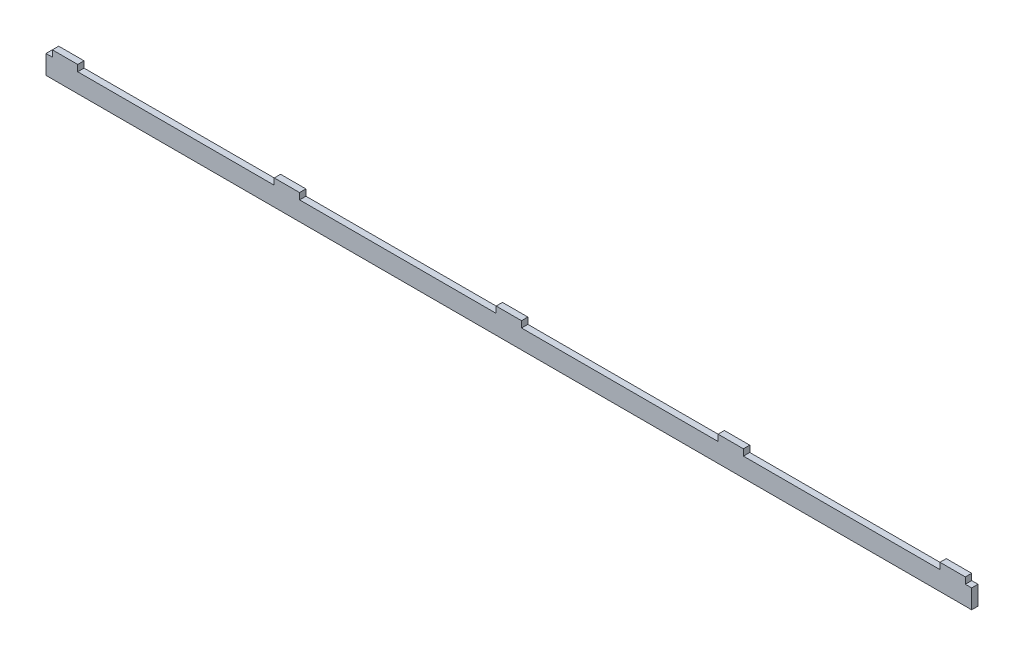
ISO-10303-21;
HEADER;
FILE_DESCRIPTION(('STEP AP214'),'2;1');
FILE_NAME('part.step','',(''),(''),'','','');
FILE_SCHEMA(('AUTOMOTIVE_DESIGN { 1 0 10303 214 1 1 1 1 }'));
ENDSEC;
DATA;
#1=APPLICATION_CONTEXT('core data for automotive mechanical design processes');
#2=APPLICATION_PROTOCOL_DEFINITION('international standard','automotive_design',2000,#1);
#3=PRODUCT_CONTEXT('',#1,'mechanical');
#4=PRODUCT('Part','Part','',(#3));
#5=PRODUCT_RELATED_PRODUCT_CATEGORY('part','',(#4));
#6=PRODUCT_DEFINITION_FORMATION('','',#4);
#7=PRODUCT_DEFINITION_CONTEXT('part definition',#1,'design');
#8=PRODUCT_DEFINITION('design','',#6,#7);
#9=PRODUCT_DEFINITION_SHAPE('','',#8);
#10=(LENGTH_UNIT() NAMED_UNIT(*) SI_UNIT(.MILLI.,.METRE.));
#11=(NAMED_UNIT(*) PLANE_ANGLE_UNIT() SI_UNIT($,.RADIAN.));
#12=(NAMED_UNIT(*) SI_UNIT($,.STERADIAN.) SOLID_ANGLE_UNIT());
#13=UNCERTAINTY_MEASURE_WITH_UNIT(LENGTH_MEASURE(1.E-05),#10,'distance_accuracy_value','');
#14=(GEOMETRIC_REPRESENTATION_CONTEXT(3) GLOBAL_UNCERTAINTY_ASSIGNED_CONTEXT((#13)) GLOBAL_UNIT_ASSIGNED_CONTEXT((#10,
#11,#12)) REPRESENTATION_CONTEXT('',''));
#15=CARTESIAN_POINT('',(0.,0.,0.));
#16=DIRECTION('',(0.,0.,1.));
#17=DIRECTION('',(1.,0.,0.));
#18=AXIS2_PLACEMENT_3D('',#15,#16,#17);
#19=CARTESIAN_POINT('',(-115.8875,4.7625,0.79375));
#20=DIRECTION('',(1.,0.,0.));
#21=DIRECTION('',(0.,1.,0.));
#22=AXIS2_PLACEMENT_3D('',#19,#20,#21);
#23=PLANE('',#22);
#24=DIRECTION('',(0.,-1.,0.));
#25=VECTOR('',#24,1.);
#26=CARTESIAN_POINT('',(-115.8875,4.7625,-0.79375));
#27=LINE('',#26,#25);
#28=CARTESIAN_POINT('',(-115.8875,4.7625,-0.79375));
#29=VERTEX_POINT('',#28);
#30=CARTESIAN_POINT('',(-115.8875,0.,-0.79375));
#31=VERTEX_POINT('',#30);
#32=EDGE_CURVE('E226',#29,#31,#27,.T.);
#33=ORIENTED_EDGE('',*,*,#32,.T.);
#34=DIRECTION('',(0.,0.,-1.));
#35=VECTOR('',#34,1.);
#36=CARTESIAN_POINT('',(-115.8875,0.,0.79375));
#37=LINE('',#36,#35);
#38=CARTESIAN_POINT('',(-115.8875,0.,0.79375));
#39=VERTEX_POINT('',#38);
#40=EDGE_CURVE('E11',#39,#31,#37,.T.);
#41=ORIENTED_EDGE('',*,*,#40,.F.);
#42=DIRECTION('',(0.,-1.,0.));
#43=VECTOR('',#42,1.);
#44=CARTESIAN_POINT('',(-115.8875,4.7625,0.79375));
#45=LINE('',#44,#43);
#46=CARTESIAN_POINT('',(-115.8875,4.7625,0.79375));
#47=VERTEX_POINT('',#46);
#48=EDGE_CURVE('E272',#47,#39,#45,.T.);
#49=ORIENTED_EDGE('',*,*,#48,.F.);
#50=DIRECTION('',(0.,0.,-1.));
#51=VECTOR('',#50,1.);
#52=CARTESIAN_POINT('',(-115.8875,4.7625,0.79375));
#53=LINE('',#52,#51);
#54=EDGE_CURVE('E222',#47,#29,#53,.T.);
#55=ORIENTED_EDGE('',*,*,#54,.T.);
#56=EDGE_LOOP('',(#33,#41,#49,#55));
#57=FACE_BOUND('',#56,.T.);
#58=ADVANCED_FACE('F34',(#57),#23,.F.);
#59=CARTESIAN_POINT('',(-115.8875,0.,0.79375));
#60=DIRECTION('',(0.,1.,0.));
#61=DIRECTION('',(0.,0.,1.));
#62=AXIS2_PLACEMENT_3D('',#59,#60,#61);
#63=PLANE('',#62);
#64=DIRECTION('',(1.,0.,0.));
#65=VECTOR('',#64,1.);
#66=CARTESIAN_POINT('',(-115.8875,0.,-0.79375));
#67=LINE('',#66,#65);
#68=CARTESIAN_POINT('',(115.8875,0.,-0.79375));
#69=VERTEX_POINT('',#68);
#70=EDGE_CURVE('E229',#31,#69,#67,.T.);
#71=ORIENTED_EDGE('',*,*,#70,.T.);
#72=DIRECTION('',(0.,0.,-1.));
#73=VECTOR('',#72,1.);
#74=CARTESIAN_POINT('',(115.8875,0.,0.79375));
#75=LINE('',#74,#73);
#76=CARTESIAN_POINT('',(115.8875,0.,0.79375));
#77=VERTEX_POINT('',#76);
#78=EDGE_CURVE('E42',#77,#69,#75,.T.);
#79=ORIENTED_EDGE('',*,*,#78,.F.);
#80=DIRECTION('',(1.,0.,0.));
#81=VECTOR('',#80,1.);
#82=CARTESIAN_POINT('',(-115.8875,0.,0.79375));
#83=LINE('',#82,#81);
#84=EDGE_CURVE('E141',#39,#77,#83,.T.);
#85=ORIENTED_EDGE('',*,*,#84,.F.);
#86=ORIENTED_EDGE('',*,*,#40,.T.);
#87=EDGE_LOOP('',(#71,#79,#85,#86));
#88=FACE_BOUND('',#87,.T.);
#89=ADVANCED_FACE('F410',(#88),#63,.F.);
#90=CARTESIAN_POINT('',(115.8875,0.,0.79375));
#91=DIRECTION('',(-1.,0.,0.));
#92=DIRECTION('',(0.,-1.,0.));
#93=AXIS2_PLACEMENT_3D('',#90,#91,#92);
#94=PLANE('',#93);
#95=DIRECTION('',(0.,1.,0.));
#96=VECTOR('',#95,1.);
#97=CARTESIAN_POINT('',(115.8875,0.,-0.79375));
#98=LINE('',#97,#96);
#99=CARTESIAN_POINT('',(115.8875,4.7625,-0.79375));
#100=VERTEX_POINT('',#99);
#101=EDGE_CURVE('E231',#69,#100,#98,.T.);
#102=ORIENTED_EDGE('',*,*,#101,.T.);
#103=DIRECTION('',(0.,0.,-1.));
#104=VECTOR('',#103,1.);
#105=CARTESIAN_POINT('',(115.8875,4.7625,0.79375));
#106=LINE('',#105,#104);
#107=CARTESIAN_POINT('',(115.8875,4.7625,0.79375));
#108=VERTEX_POINT('',#107);
#109=EDGE_CURVE('E327',#108,#100,#106,.T.);
#110=ORIENTED_EDGE('',*,*,#109,.F.);
#111=DIRECTION('',(0.,1.,0.));
#112=VECTOR('',#111,1.);
#113=CARTESIAN_POINT('',(115.8875,0.,0.79375));
#114=LINE('',#113,#112);
#115=EDGE_CURVE('E335',#77,#108,#114,.T.);
#116=ORIENTED_EDGE('',*,*,#115,.F.);
#117=ORIENTED_EDGE('',*,*,#78,.T.);
#118=EDGE_LOOP('',(#102,#110,#116,#117));
#119=FACE_BOUND('',#118,.T.);
#120=ADVANCED_FACE('F333',(#119),#94,.F.);
#121=CARTESIAN_POINT('',(115.8875,4.7625,0.79375));
#122=DIRECTION('',(0.,-1.,0.));
#123=DIRECTION('',(1.,0.,0.));
#124=AXIS2_PLACEMENT_3D('',#121,#122,#123);
#125=PLANE('',#124);
#126=DIRECTION('',(-1.,0.,0.));
#127=VECTOR('',#126,1.);
#128=CARTESIAN_POINT('',(115.8875,4.7625,-0.79375));
#129=LINE('',#128,#127);
#130=CARTESIAN_POINT('',(114.3,4.76250000000001,-0.79375));
#131=VERTEX_POINT('',#130);
#132=EDGE_CURVE('E233',#100,#131,#129,.T.);
#133=ORIENTED_EDGE('',*,*,#132,.T.);
#134=DIRECTION('',(0.,0.,-1.));
#135=VECTOR('',#134,1.);
#136=CARTESIAN_POINT('',(114.3,4.76250000000001,0.79375));
#137=LINE('',#136,#135);
#138=CARTESIAN_POINT('',(114.3,4.76250000000001,0.79375));
#139=VERTEX_POINT('',#138);
#140=EDGE_CURVE('E324',#139,#131,#137,.T.);
#141=ORIENTED_EDGE('',*,*,#140,.F.);
#142=DIRECTION('',(-1.,0.,0.));
#143=VECTOR('',#142,1.);
#144=CARTESIAN_POINT('',(115.8875,4.7625,0.79375));
#145=LINE('',#144,#143);
#146=EDGE_CURVE('E353',#108,#139,#145,.T.);
#147=ORIENTED_EDGE('',*,*,#146,.F.);
#148=ORIENTED_EDGE('',*,*,#109,.T.);
#149=EDGE_LOOP('',(#133,#141,#147,#148));
#150=FACE_BOUND('',#149,.T.);
#151=ADVANCED_FACE('F344',(#150),#125,.F.);
#152=CARTESIAN_POINT('',(114.3,4.76250000000001,0.79375));
#153=DIRECTION('',(-1.,0.,0.));
#154=DIRECTION('',(0.,-1.,0.));
#155=AXIS2_PLACEMENT_3D('',#152,#153,#154);
#156=PLANE('',#155);
#157=DIRECTION('',(0.,1.,0.));
#158=VECTOR('',#157,1.);
#159=CARTESIAN_POINT('',(114.3,4.76250000000001,-0.79375));
#160=LINE('',#159,#158);
#161=CARTESIAN_POINT('',(114.3,6.35,-0.79375));
#162=VERTEX_POINT('',#161);
#163=EDGE_CURVE('E235',#131,#162,#160,.T.);
#164=ORIENTED_EDGE('',*,*,#163,.T.);
#165=DIRECTION('',(0.,0.,-1.));
#166=VECTOR('',#165,1.);
#167=CARTESIAN_POINT('',(114.3,6.35,0.79375));
#168=LINE('',#167,#166);
#169=CARTESIAN_POINT('',(114.3,6.35,0.79375));
#170=VERTEX_POINT('',#169);
#171=EDGE_CURVE('E321',#170,#162,#168,.T.);
#172=ORIENTED_EDGE('',*,*,#171,.F.);
#173=DIRECTION('',(0.,1.,0.));
#174=VECTOR('',#173,1.);
#175=CARTESIAN_POINT('',(114.3,4.76250000000001,0.79375));
#176=LINE('',#175,#174);
#177=EDGE_CURVE('E350',#139,#170,#176,.T.);
#178=ORIENTED_EDGE('',*,*,#177,.F.);
#179=ORIENTED_EDGE('',*,*,#140,.T.);
#180=EDGE_LOOP('',(#164,#172,#178,#179));
#181=FACE_BOUND('',#180,.T.);
#182=ADVANCED_FACE('F348',(#181),#156,.F.);
#183=CARTESIAN_POINT('',(114.3,6.35,0.79375));
#184=DIRECTION('',(0.,-1.,0.));
#185=DIRECTION('',(1.,0.,0.));
#186=AXIS2_PLACEMENT_3D('',#183,#184,#185);
#187=PLANE('',#186);
#188=DIRECTION('',(-1.,0.,0.));
#189=VECTOR('',#188,1.);
#190=CARTESIAN_POINT('',(114.3,6.35,-0.79375));
#191=LINE('',#190,#189);
#192=CARTESIAN_POINT('',(107.95,6.35,-0.79375));
#193=VERTEX_POINT('',#192);
#194=EDGE_CURVE('E237',#162,#193,#191,.T.);
#195=ORIENTED_EDGE('',*,*,#194,.T.);
#196=DIRECTION('',(0.,0.,-1.));
#197=VECTOR('',#196,1.);
#198=CARTESIAN_POINT('',(107.95,6.35,0.79375));
#199=LINE('',#198,#197);
#200=CARTESIAN_POINT('',(107.95,6.35,0.79375));
#201=VERTEX_POINT('',#200);
#202=EDGE_CURVE('E318',#201,#193,#199,.T.);
#203=ORIENTED_EDGE('',*,*,#202,.F.);
#204=DIRECTION('',(-1.,0.,0.));
#205=VECTOR('',#204,1.);
#206=CARTESIAN_POINT('',(114.3,6.35,0.79375));
#207=LINE('',#206,#205);
#208=EDGE_CURVE('E352',#170,#201,#207,.T.);
#209=ORIENTED_EDGE('',*,*,#208,.F.);
#210=ORIENTED_EDGE('',*,*,#171,.T.);
#211=EDGE_LOOP('',(#195,#203,#209,#210));
#212=FACE_BOUND('',#211,.T.);
#213=ADVANCED_FACE('F423',(#212),#187,.F.);
#214=CARTESIAN_POINT('',(107.95,6.35,0.79375));
#215=DIRECTION('',(1.,0.,0.));
#216=DIRECTION('',(0.,1.,0.));
#217=AXIS2_PLACEMENT_3D('',#214,#215,#216);
#218=PLANE('',#217);
#219=DIRECTION('',(0.,-1.,0.));
#220=VECTOR('',#219,1.);
#221=CARTESIAN_POINT('',(107.95,6.35,-0.79375));
#222=LINE('',#221,#220);
#223=CARTESIAN_POINT('',(107.95,4.76250000000001,-0.79375));
#224=VERTEX_POINT('',#223);
#225=EDGE_CURVE('E239',#193,#224,#222,.T.);
#226=ORIENTED_EDGE('',*,*,#225,.T.);
#227=DIRECTION('',(0.,0.,-1.));
#228=VECTOR('',#227,1.);
#229=CARTESIAN_POINT('',(107.95,4.76250000000001,0.79375));
#230=LINE('',#229,#228);
#231=CARTESIAN_POINT('',(107.95,4.76250000000001,0.79375));
#232=VERTEX_POINT('',#231);
#233=EDGE_CURVE('E315',#232,#224,#230,.T.);
#234=ORIENTED_EDGE('',*,*,#233,.F.);
#235=DIRECTION('',(0.,-1.,0.));
#236=VECTOR('',#235,1.);
#237=CARTESIAN_POINT('',(107.95,6.35,0.79375));
#238=LINE('',#237,#236);
#239=EDGE_CURVE('E355',#201,#232,#238,.T.);
#240=ORIENTED_EDGE('',*,*,#239,.F.);
#241=ORIENTED_EDGE('',*,*,#202,.T.);
#242=EDGE_LOOP('',(#226,#234,#240,#241));
#243=FACE_BOUND('',#242,.T.);
#244=ADVANCED_FACE('F426',(#243),#218,.F.);
#245=CARTESIAN_POINT('',(107.95,4.76250000000001,0.79375));
#246=DIRECTION('',(0.,-1.,0.));
#247=DIRECTION('',(0.,0.,-1.));
#248=AXIS2_PLACEMENT_3D('',#245,#246,#247);
#249=PLANE('',#248);
#250=DIRECTION('',(-1.,0.,0.));
#251=VECTOR('',#250,1.);
#252=CARTESIAN_POINT('',(107.95,4.76250000000001,-0.79375));
#253=LINE('',#252,#251);
#254=CARTESIAN_POINT('',(58.7375,4.76250000000001,-0.79375));
#255=VERTEX_POINT('',#254);
#256=EDGE_CURVE('E241',#224,#255,#253,.T.);
#257=ORIENTED_EDGE('',*,*,#256,.T.);
#258=DIRECTION('',(0.,0.,-1.));
#259=VECTOR('',#258,1.);
#260=CARTESIAN_POINT('',(58.7375,4.76250000000001,0.79375));
#261=LINE('',#260,#259);
#262=CARTESIAN_POINT('',(58.7375,4.76250000000001,0.79375));
#263=VERTEX_POINT('',#262);
#264=EDGE_CURVE('E312',#263,#255,#261,.T.);
#265=ORIENTED_EDGE('',*,*,#264,.F.);
#266=DIRECTION('',(-1.,0.,0.));
#267=VECTOR('',#266,1.);
#268=CARTESIAN_POINT('',(107.95,4.76250000000001,0.79375));
#269=LINE('',#268,#267);
#270=EDGE_CURVE('E361',#232,#263,#269,.T.);
#271=ORIENTED_EDGE('',*,*,#270,.F.);
#272=ORIENTED_EDGE('',*,*,#233,.T.);
#273=EDGE_LOOP('',(#257,#265,#271,#272));
#274=FACE_BOUND('',#273,.T.);
#275=ADVANCED_FACE('F430',(#274),#249,.F.);
#276=CARTESIAN_POINT('',(58.7375,4.76250000000001,0.79375));
#277=DIRECTION('',(-1.,0.,0.));
#278=DIRECTION('',(0.,-1.,0.));
#279=AXIS2_PLACEMENT_3D('',#276,#277,#278);
#280=PLANE('',#279);
#281=DIRECTION('',(0.,1.,0.));
#282=VECTOR('',#281,1.);
#283=CARTESIAN_POINT('',(58.7375,4.76250000000001,-0.79375));
#284=LINE('',#283,#282);
#285=CARTESIAN_POINT('',(58.7375000000001,6.35,-0.79375));
#286=VERTEX_POINT('',#285);
#287=EDGE_CURVE('E243',#255,#286,#284,.T.);
#288=ORIENTED_EDGE('',*,*,#287,.T.);
#289=DIRECTION('',(0.,0.,-1.));
#290=VECTOR('',#289,1.);
#291=CARTESIAN_POINT('',(58.7375000000001,6.35,0.79375));
#292=LINE('',#291,#290);
#293=CARTESIAN_POINT('',(58.7375000000001,6.35,0.79375));
#294=VERTEX_POINT('',#293);
#295=EDGE_CURVE('E309',#294,#286,#292,.T.);
#296=ORIENTED_EDGE('',*,*,#295,.F.);
#297=DIRECTION('',(0.,1.,0.));
#298=VECTOR('',#297,1.);
#299=CARTESIAN_POINT('',(58.7375,4.76250000000001,0.79375));
#300=LINE('',#299,#298);
#301=EDGE_CURVE('E363',#263,#294,#300,.T.);
#302=ORIENTED_EDGE('',*,*,#301,.F.);
#303=ORIENTED_EDGE('',*,*,#264,.T.);
#304=EDGE_LOOP('',(#288,#296,#302,#303));
#305=FACE_BOUND('',#304,.T.);
#306=ADVANCED_FACE('F434',(#305),#280,.F.);
#307=CARTESIAN_POINT('',(58.7375000000001,6.35,0.79375));
#308=DIRECTION('',(0.,-1.,0.));
#309=DIRECTION('',(0.,0.,-1.));
#310=AXIS2_PLACEMENT_3D('',#307,#308,#309);
#311=PLANE('',#310);
#312=DIRECTION('',(-1.,0.,0.));
#313=VECTOR('',#312,1.);
#314=CARTESIAN_POINT('',(58.7375000000001,6.35,-0.79375));
#315=LINE('',#314,#313);
#316=CARTESIAN_POINT('',(52.3875,6.35,-0.79375));
#317=VERTEX_POINT('',#316);
#318=EDGE_CURVE('E245',#286,#317,#315,.T.);
#319=ORIENTED_EDGE('',*,*,#318,.T.);
#320=DIRECTION('',(0.,0.,-1.));
#321=VECTOR('',#320,1.);
#322=CARTESIAN_POINT('',(52.3875,6.35,0.79375));
#323=LINE('',#322,#321);
#324=CARTESIAN_POINT('',(52.3875,6.35,0.79375));
#325=VERTEX_POINT('',#324);
#326=EDGE_CURVE('E306',#325,#317,#323,.T.);
#327=ORIENTED_EDGE('',*,*,#326,.F.);
#328=DIRECTION('',(-1.,0.,0.));
#329=VECTOR('',#328,1.);
#330=CARTESIAN_POINT('',(58.7375000000001,6.35,0.79375));
#331=LINE('',#330,#329);
#332=EDGE_CURVE('E365',#294,#325,#331,.T.);
#333=ORIENTED_EDGE('',*,*,#332,.F.);
#334=ORIENTED_EDGE('',*,*,#295,.T.);
#335=EDGE_LOOP('',(#319,#327,#333,#334));
#336=FACE_BOUND('',#335,.T.);
#337=ADVANCED_FACE('F438',(#336),#311,.F.);
#338=CARTESIAN_POINT('',(52.3875,6.35,0.79375));
#339=DIRECTION('',(1.,0.,0.));
#340=DIRECTION('',(0.,0.,-1.));
#341=AXIS2_PLACEMENT_3D('',#338,#339,#340);
#342=PLANE('',#341);
#343=DIRECTION('',(0.,-1.,0.));
#344=VECTOR('',#343,1.);
#345=CARTESIAN_POINT('',(52.3875,6.35,-0.79375));
#346=LINE('',#345,#344);
#347=CARTESIAN_POINT('',(52.3875,4.76250000000001,-0.79375));
#348=VERTEX_POINT('',#347);
#349=EDGE_CURVE('E247',#317,#348,#346,.T.);
#350=ORIENTED_EDGE('',*,*,#349,.T.);
#351=DIRECTION('',(0.,0.,-1.));
#352=VECTOR('',#351,1.);
#353=CARTESIAN_POINT('',(52.3875,4.76250000000001,0.79375));
#354=LINE('',#353,#352);
#355=CARTESIAN_POINT('',(52.3875,4.76250000000001,0.79375));
#356=VERTEX_POINT('',#355);
#357=EDGE_CURVE('E303',#356,#348,#354,.T.);
#358=ORIENTED_EDGE('',*,*,#357,.F.);
#359=DIRECTION('',(0.,-1.,0.));
#360=VECTOR('',#359,1.);
#361=CARTESIAN_POINT('',(52.3875,6.35,0.79375));
#362=LINE('',#361,#360);
#363=EDGE_CURVE('E367',#325,#356,#362,.T.);
#364=ORIENTED_EDGE('',*,*,#363,.F.);
#365=ORIENTED_EDGE('',*,*,#326,.T.);
#366=EDGE_LOOP('',(#350,#358,#364,#365));
#367=FACE_BOUND('',#366,.T.);
#368=ADVANCED_FACE('F442',(#367),#342,.F.);
#369=CARTESIAN_POINT('',(52.3875,4.76250000000001,0.79375));
#370=DIRECTION('',(0.,-1.,0.));
#371=DIRECTION('',(0.,0.,-1.));
#372=AXIS2_PLACEMENT_3D('',#369,#370,#371);
#373=PLANE('',#372);
#374=DIRECTION('',(-1.,0.,0.));
#375=VECTOR('',#374,1.);
#376=CARTESIAN_POINT('',(52.3875,4.76250000000001,-0.79375));
#377=LINE('',#376,#375);
#378=CARTESIAN_POINT('',(3.175,4.76250000000001,-0.79375));
#379=VERTEX_POINT('',#378);
#380=EDGE_CURVE('E249',#348,#379,#377,.T.);
#381=ORIENTED_EDGE('',*,*,#380,.T.);
#382=DIRECTION('',(0.,0.,-1.));
#383=VECTOR('',#382,1.);
#384=CARTESIAN_POINT('',(3.175,4.76250000000001,0.79375));
#385=LINE('',#384,#383);
#386=CARTESIAN_POINT('',(3.175,4.76250000000001,0.79375));
#387=VERTEX_POINT('',#386);
#388=EDGE_CURVE('E300',#387,#379,#385,.T.);
#389=ORIENTED_EDGE('',*,*,#388,.F.);
#390=DIRECTION('',(-1.,0.,0.));
#391=VECTOR('',#390,1.);
#392=CARTESIAN_POINT('',(52.3875,4.76250000000001,0.79375));
#393=LINE('',#392,#391);
#394=EDGE_CURVE('E369',#356,#387,#393,.T.);
#395=ORIENTED_EDGE('',*,*,#394,.F.);
#396=ORIENTED_EDGE('',*,*,#357,.T.);
#397=EDGE_LOOP('',(#381,#389,#395,#396));
#398=FACE_BOUND('',#397,.T.);
#399=ADVANCED_FACE('F446',(#398),#373,.F.);
#400=CARTESIAN_POINT('',(3.175,4.76250000000001,0.79375));
#401=DIRECTION('',(-1.,0.,0.));
#402=DIRECTION('',(0.,-1.,0.));
#403=AXIS2_PLACEMENT_3D('',#400,#401,#402);
#404=PLANE('',#403);
#405=DIRECTION('',(0.,1.,0.));
#406=VECTOR('',#405,1.);
#407=CARTESIAN_POINT('',(3.175,4.76250000000001,-0.79375));
#408=LINE('',#407,#406);
#409=CARTESIAN_POINT('',(3.175,6.35000000000001,-0.79375));
#410=VERTEX_POINT('',#409);
#411=EDGE_CURVE('E251',#379,#410,#408,.T.);
#412=ORIENTED_EDGE('',*,*,#411,.T.);
#413=DIRECTION('',(0.,0.,-1.));
#414=VECTOR('',#413,1.);
#415=CARTESIAN_POINT('',(3.175,6.35000000000001,0.79375));
#416=LINE('',#415,#414);
#417=CARTESIAN_POINT('',(3.175,6.35000000000001,0.79375));
#418=VERTEX_POINT('',#417);
#419=EDGE_CURVE('E297',#418,#410,#416,.T.);
#420=ORIENTED_EDGE('',*,*,#419,.F.);
#421=DIRECTION('',(0.,1.,0.));
#422=VECTOR('',#421,1.);
#423=CARTESIAN_POINT('',(3.175,4.76250000000001,0.79375));
#424=LINE('',#423,#422);
#425=EDGE_CURVE('E371',#387,#418,#424,.T.);
#426=ORIENTED_EDGE('',*,*,#425,.F.);
#427=ORIENTED_EDGE('',*,*,#388,.T.);
#428=EDGE_LOOP('',(#412,#420,#426,#427));
#429=FACE_BOUND('',#428,.T.);
#430=ADVANCED_FACE('F450',(#429),#404,.F.);
#431=CARTESIAN_POINT('',(3.175,6.35000000000001,0.79375));
#432=DIRECTION('',(0.,-1.,0.));
#433=DIRECTION('',(0.,0.,-1.));
#434=AXIS2_PLACEMENT_3D('',#431,#432,#433);
#435=PLANE('',#434);
#436=DIRECTION('',(-1.,0.,0.));
#437=VECTOR('',#436,1.);
#438=CARTESIAN_POINT('',(3.175,6.35000000000001,-0.79375));
#439=LINE('',#438,#437);
#440=CARTESIAN_POINT('',(-3.175,6.35000000000001,-0.79375));
#441=VERTEX_POINT('',#440);
#442=EDGE_CURVE('E253',#410,#441,#439,.T.);
#443=ORIENTED_EDGE('',*,*,#442,.T.);
#444=DIRECTION('',(0.,0.,-1.));
#445=VECTOR('',#444,1.);
#446=CARTESIAN_POINT('',(-3.175,6.35000000000001,0.79375));
#447=LINE('',#446,#445);
#448=CARTESIAN_POINT('',(-3.175,6.35000000000001,0.79375));
#449=VERTEX_POINT('',#448);
#450=EDGE_CURVE('E294',#449,#441,#447,.T.);
#451=ORIENTED_EDGE('',*,*,#450,.F.);
#452=DIRECTION('',(-1.,0.,0.));
#453=VECTOR('',#452,1.);
#454=CARTESIAN_POINT('',(3.175,6.35000000000001,0.79375));
#455=LINE('',#454,#453);
#456=EDGE_CURVE('E373',#418,#449,#455,.T.);
#457=ORIENTED_EDGE('',*,*,#456,.F.);
#458=ORIENTED_EDGE('',*,*,#419,.T.);
#459=EDGE_LOOP('',(#443,#451,#457,#458));
#460=FACE_BOUND('',#459,.T.);
#461=ADVANCED_FACE('F454',(#460),#435,.F.);
#462=CARTESIAN_POINT('',(-3.175,6.35000000000001,0.79375));
#463=DIRECTION('',(1.,0.,0.));
#464=DIRECTION('',(0.,1.,0.));
#465=AXIS2_PLACEMENT_3D('',#462,#463,#464);
#466=PLANE('',#465);
#467=DIRECTION('',(0.,-1.,0.));
#468=VECTOR('',#467,1.);
#469=CARTESIAN_POINT('',(-3.175,6.35000000000001,-0.79375));
#470=LINE('',#469,#468);
#471=CARTESIAN_POINT('',(-3.175,4.76250000000001,-0.79375));
#472=VERTEX_POINT('',#471);
#473=EDGE_CURVE('E255',#441,#472,#470,.T.);
#474=ORIENTED_EDGE('',*,*,#473,.T.);
#475=DIRECTION('',(0.,0.,-1.));
#476=VECTOR('',#475,1.);
#477=CARTESIAN_POINT('',(-3.175,4.76250000000001,0.79375));
#478=LINE('',#477,#476);
#479=CARTESIAN_POINT('',(-3.175,4.76250000000001,0.79375));
#480=VERTEX_POINT('',#479);
#481=EDGE_CURVE('E291',#480,#472,#478,.T.);
#482=ORIENTED_EDGE('',*,*,#481,.F.);
#483=DIRECTION('',(0.,-1.,0.));
#484=VECTOR('',#483,1.);
#485=CARTESIAN_POINT('',(-3.175,6.35000000000001,0.79375));
#486=LINE('',#485,#484);
#487=EDGE_CURVE('E375',#449,#480,#486,.T.);
#488=ORIENTED_EDGE('',*,*,#487,.F.);
#489=ORIENTED_EDGE('',*,*,#450,.T.);
#490=EDGE_LOOP('',(#474,#482,#488,#489));
#491=FACE_BOUND('',#490,.T.);
#492=ADVANCED_FACE('F458',(#491),#466,.F.);
#493=CARTESIAN_POINT('',(-3.175,4.76250000000001,0.79375));
#494=DIRECTION('',(0.,-1.,0.));
#495=DIRECTION('',(0.,0.,-1.));
#496=AXIS2_PLACEMENT_3D('',#493,#494,#495);
#497=PLANE('',#496);
#498=DIRECTION('',(-1.,0.,0.));
#499=VECTOR('',#498,1.);
#500=CARTESIAN_POINT('',(-3.175,4.76250000000001,-0.79375));
#501=LINE('',#500,#499);
#502=CARTESIAN_POINT('',(-52.3875,4.76250000000001,-0.79375));
#503=VERTEX_POINT('',#502);
#504=EDGE_CURVE('E257',#472,#503,#501,.T.);
#505=ORIENTED_EDGE('',*,*,#504,.T.);
#506=DIRECTION('',(0.,0.,-1.));
#507=VECTOR('',#506,1.);
#508=CARTESIAN_POINT('',(-52.3875,4.76250000000001,0.79375));
#509=LINE('',#508,#507);
#510=CARTESIAN_POINT('',(-52.3875,4.76250000000001,0.79375));
#511=VERTEX_POINT('',#510);
#512=EDGE_CURVE('E288',#511,#503,#509,.T.);
#513=ORIENTED_EDGE('',*,*,#512,.F.);
#514=DIRECTION('',(-1.,0.,0.));
#515=VECTOR('',#514,1.);
#516=CARTESIAN_POINT('',(-3.175,4.76250000000001,0.79375));
#517=LINE('',#516,#515);
#518=EDGE_CURVE('E377',#480,#511,#517,.T.);
#519=ORIENTED_EDGE('',*,*,#518,.F.);
#520=ORIENTED_EDGE('',*,*,#481,.T.);
#521=EDGE_LOOP('',(#505,#513,#519,#520));
#522=FACE_BOUND('',#521,.T.);
#523=ADVANCED_FACE('F462',(#522),#497,.F.);
#524=CARTESIAN_POINT('',(-52.3875,4.76250000000001,0.79375));
#525=DIRECTION('',(-1.,0.,0.));
#526=DIRECTION('',(0.,0.,1.));
#527=AXIS2_PLACEMENT_3D('',#524,#525,#526);
#528=PLANE('',#527);
#529=DIRECTION('',(0.,1.,0.));
#530=VECTOR('',#529,1.);
#531=CARTESIAN_POINT('',(-52.3875,4.76250000000001,-0.79375));
#532=LINE('',#531,#530);
#533=CARTESIAN_POINT('',(-52.3875,6.35,-0.79375));
#534=VERTEX_POINT('',#533);
#535=EDGE_CURVE('E259',#503,#534,#532,.T.);
#536=ORIENTED_EDGE('',*,*,#535,.T.);
#537=DIRECTION('',(0.,0.,-1.));
#538=VECTOR('',#537,1.);
#539=CARTESIAN_POINT('',(-52.3875,6.35,0.79375));
#540=LINE('',#539,#538);
#541=CARTESIAN_POINT('',(-52.3875,6.35,0.79375));
#542=VERTEX_POINT('',#541);
#543=EDGE_CURVE('E285',#542,#534,#540,.T.);
#544=ORIENTED_EDGE('',*,*,#543,.F.);
#545=DIRECTION('',(0.,1.,0.));
#546=VECTOR('',#545,1.);
#547=CARTESIAN_POINT('',(-52.3875,4.76250000000001,0.79375));
#548=LINE('',#547,#546);
#549=EDGE_CURVE('E379',#511,#542,#548,.T.);
#550=ORIENTED_EDGE('',*,*,#549,.F.);
#551=ORIENTED_EDGE('',*,*,#512,.T.);
#552=EDGE_LOOP('',(#536,#544,#550,#551));
#553=FACE_BOUND('',#552,.T.);
#554=ADVANCED_FACE('F466',(#553),#528,.F.);
#555=CARTESIAN_POINT('',(-52.3875,6.35,0.79375));
#556=DIRECTION('',(0.,-1.,0.));
#557=DIRECTION('',(0.,0.,-1.));
#558=AXIS2_PLACEMENT_3D('',#555,#556,#557);
#559=PLANE('',#558);
#560=DIRECTION('',(-1.,0.,0.));
#561=VECTOR('',#560,1.);
#562=CARTESIAN_POINT('',(-52.3875,6.35,-0.79375));
#563=LINE('',#562,#561);
#564=CARTESIAN_POINT('',(-58.7375000000001,6.35,-0.79375));
#565=VERTEX_POINT('',#564);
#566=EDGE_CURVE('E261',#534,#565,#563,.T.);
#567=ORIENTED_EDGE('',*,*,#566,.T.);
#568=DIRECTION('',(0.,0.,-1.));
#569=VECTOR('',#568,1.);
#570=CARTESIAN_POINT('',(-58.7375000000001,6.35,0.79375));
#571=LINE('',#570,#569);
#572=CARTESIAN_POINT('',(-58.7375000000001,6.35,0.79375));
#573=VERTEX_POINT('',#572);
#574=EDGE_CURVE('E282',#573,#565,#571,.T.);
#575=ORIENTED_EDGE('',*,*,#574,.F.);
#576=DIRECTION('',(-1.,0.,0.));
#577=VECTOR('',#576,1.);
#578=CARTESIAN_POINT('',(-52.3875,6.35,0.79375));
#579=LINE('',#578,#577);
#580=EDGE_CURVE('E381',#542,#573,#579,.T.);
#581=ORIENTED_EDGE('',*,*,#580,.F.);
#582=ORIENTED_EDGE('',*,*,#543,.T.);
#583=EDGE_LOOP('',(#567,#575,#581,#582));
#584=FACE_BOUND('',#583,.T.);
#585=ADVANCED_FACE('F470',(#584),#559,.F.);
#586=CARTESIAN_POINT('',(-58.7375000000001,6.35,0.79375));
#587=DIRECTION('',(1.,0.,0.));
#588=DIRECTION('',(0.,1.,0.));
#589=AXIS2_PLACEMENT_3D('',#586,#587,#588);
#590=PLANE('',#589);
#591=DIRECTION('',(0.,-1.,0.));
#592=VECTOR('',#591,1.);
#593=CARTESIAN_POINT('',(-58.7375000000001,6.35,-0.79375));
#594=LINE('',#593,#592);
#595=CARTESIAN_POINT('',(-58.7375,4.76250000000001,-0.79375));
#596=VERTEX_POINT('',#595);
#597=EDGE_CURVE('E263',#565,#596,#594,.T.);
#598=ORIENTED_EDGE('',*,*,#597,.T.);
#599=DIRECTION('',(0.,0.,-1.));
#600=VECTOR('',#599,1.);
#601=CARTESIAN_POINT('',(-58.7375,4.76250000000001,0.79375));
#602=LINE('',#601,#600);
#603=CARTESIAN_POINT('',(-58.7375,4.76250000000001,0.79375));
#604=VERTEX_POINT('',#603);
#605=EDGE_CURVE('E279',#604,#596,#602,.T.);
#606=ORIENTED_EDGE('',*,*,#605,.F.);
#607=DIRECTION('',(0.,-1.,0.));
#608=VECTOR('',#607,1.);
#609=CARTESIAN_POINT('',(-58.7375000000001,6.35,0.79375));
#610=LINE('',#609,#608);
#611=EDGE_CURVE('E383',#573,#604,#610,.T.);
#612=ORIENTED_EDGE('',*,*,#611,.F.);
#613=ORIENTED_EDGE('',*,*,#574,.T.);
#614=EDGE_LOOP('',(#598,#606,#612,#613));
#615=FACE_BOUND('',#614,.T.);
#616=ADVANCED_FACE('F474',(#615),#590,.F.);
#617=CARTESIAN_POINT('',(-58.7375,4.76250000000001,0.79375));
#618=DIRECTION('',(0.,-1.,0.));
#619=DIRECTION('',(0.,0.,-1.));
#620=AXIS2_PLACEMENT_3D('',#617,#618,#619);
#621=PLANE('',#620);
#622=DIRECTION('',(-1.,0.,0.));
#623=VECTOR('',#622,1.);
#624=CARTESIAN_POINT('',(-58.7375,4.76250000000001,-0.79375));
#625=LINE('',#624,#623);
#626=CARTESIAN_POINT('',(-107.95,4.76250000000001,-0.79375));
#627=VERTEX_POINT('',#626);
#628=EDGE_CURVE('E265',#596,#627,#625,.T.);
#629=ORIENTED_EDGE('',*,*,#628,.T.);
#630=DIRECTION('',(0.,0.,-1.));
#631=VECTOR('',#630,1.);
#632=CARTESIAN_POINT('',(-107.95,4.76250000000001,0.79375));
#633=LINE('',#632,#631);
#634=CARTESIAN_POINT('',(-107.95,4.76250000000001,0.79375));
#635=VERTEX_POINT('',#634);
#636=EDGE_CURVE('E276',#635,#627,#633,.T.);
#637=ORIENTED_EDGE('',*,*,#636,.F.);
#638=DIRECTION('',(-1.,0.,0.));
#639=VECTOR('',#638,1.);
#640=CARTESIAN_POINT('',(-58.7375,4.76250000000001,0.79375));
#641=LINE('',#640,#639);
#642=EDGE_CURVE('E385',#604,#635,#641,.T.);
#643=ORIENTED_EDGE('',*,*,#642,.F.);
#644=ORIENTED_EDGE('',*,*,#605,.T.);
#645=EDGE_LOOP('',(#629,#637,#643,#644));
#646=FACE_BOUND('',#645,.T.);
#647=ADVANCED_FACE('F391',(#646),#621,.F.);
#648=CARTESIAN_POINT('',(-107.95,4.76250000000001,0.79375));
#649=DIRECTION('',(-1.,0.,0.));
#650=DIRECTION('',(0.,-1.,0.));
#651=AXIS2_PLACEMENT_3D('',#648,#649,#650);
#652=PLANE('',#651);
#653=DIRECTION('',(0.,1.,0.));
#654=VECTOR('',#653,1.);
#655=CARTESIAN_POINT('',(-107.95,4.76250000000001,-0.79375));
#656=LINE('',#655,#654);
#657=CARTESIAN_POINT('',(-107.95,6.35,-0.79375));
#658=VERTEX_POINT('',#657);
#659=EDGE_CURVE('E267',#627,#658,#656,.T.);
#660=ORIENTED_EDGE('',*,*,#659,.T.);
#661=DIRECTION('',(0.,0.,-1.));
#662=VECTOR('',#661,1.);
#663=CARTESIAN_POINT('',(-107.95,6.35,0.79375));
#664=LINE('',#663,#662);
#665=CARTESIAN_POINT('',(-107.95,6.35,0.79375));
#666=VERTEX_POINT('',#665);
#667=EDGE_CURVE('E217',#666,#658,#664,.T.);
#668=ORIENTED_EDGE('',*,*,#667,.F.);
#669=DIRECTION('',(0.,1.,0.));
#670=VECTOR('',#669,1.);
#671=CARTESIAN_POINT('',(-107.95,4.76250000000001,0.79375));
#672=LINE('',#671,#670);
#673=EDGE_CURVE('E208',#635,#666,#672,.T.);
#674=ORIENTED_EDGE('',*,*,#673,.F.);
#675=ORIENTED_EDGE('',*,*,#636,.T.);
#676=EDGE_LOOP('',(#660,#668,#674,#675));
#677=FACE_BOUND('',#676,.T.);
#678=ADVANCED_FACE('F395',(#677),#652,.F.);
#679=CARTESIAN_POINT('',(-107.95,6.35,0.79375));
#680=DIRECTION('',(0.,-1.,0.));
#681=DIRECTION('',(1.,0.,0.));
#682=AXIS2_PLACEMENT_3D('',#679,#680,#681);
#683=PLANE('',#682);
#684=DIRECTION('',(-1.,0.,0.));
#685=VECTOR('',#684,1.);
#686=CARTESIAN_POINT('',(-107.95,6.35,-0.79375));
#687=LINE('',#686,#685);
#688=CARTESIAN_POINT('',(-114.3,6.35,-0.79375));
#689=VERTEX_POINT('',#688);
#690=EDGE_CURVE('E216',#658,#689,#687,.T.);
#691=ORIENTED_EDGE('',*,*,#690,.T.);
#692=DIRECTION('',(0.,0.,-1.));
#693=VECTOR('',#692,1.);
#694=CARTESIAN_POINT('',(-114.3,6.35,0.79375));
#695=LINE('',#694,#693);
#696=CARTESIAN_POINT('',(-114.3,6.35,0.79375));
#697=VERTEX_POINT('',#696);
#698=EDGE_CURVE('E213',#697,#689,#695,.T.);
#699=ORIENTED_EDGE('',*,*,#698,.F.);
#700=DIRECTION('',(-1.,0.,0.));
#701=VECTOR('',#700,1.);
#702=CARTESIAN_POINT('',(-107.95,6.35,0.79375));
#703=LINE('',#702,#701);
#704=EDGE_CURVE('E202',#666,#697,#703,.T.);
#705=ORIENTED_EDGE('',*,*,#704,.F.);
#706=ORIENTED_EDGE('',*,*,#667,.T.);
#707=EDGE_LOOP('',(#691,#699,#705,#706));
#708=FACE_BOUND('',#707,.T.);
#709=ADVANCED_FACE('F214',(#708),#683,.F.);
#710=CARTESIAN_POINT('',(-114.3,6.35,0.79375));
#711=DIRECTION('',(1.,0.,0.));
#712=DIRECTION('',(0.,1.,0.));
#713=AXIS2_PLACEMENT_3D('',#710,#711,#712);
#714=PLANE('',#713);
#715=DIRECTION('',(0.,-1.,0.));
#716=VECTOR('',#715,1.);
#717=CARTESIAN_POINT('',(-114.3,6.35,-0.79375));
#718=LINE('',#717,#716);
#719=CARTESIAN_POINT('',(-114.3,4.76250000000001,-0.79375));
#720=VERTEX_POINT('',#719);
#721=EDGE_CURVE('E127',#689,#720,#718,.T.);
#722=ORIENTED_EDGE('',*,*,#721,.T.);
#723=DIRECTION('',(0.,0.,-1.));
#724=VECTOR('',#723,1.);
#725=CARTESIAN_POINT('',(-114.3,4.76250000000001,0.79375));
#726=LINE('',#725,#724);
#727=CARTESIAN_POINT('',(-114.3,4.76250000000001,0.79375));
#728=VERTEX_POINT('',#727);
#729=EDGE_CURVE('E218',#728,#720,#726,.T.);
#730=ORIENTED_EDGE('',*,*,#729,.F.);
#731=DIRECTION('',(0.,-1.,0.));
#732=VECTOR('',#731,1.);
#733=CARTESIAN_POINT('',(-114.3,6.35,0.79375));
#734=LINE('',#733,#732);
#735=EDGE_CURVE('E206',#697,#728,#734,.T.);
#736=ORIENTED_EDGE('',*,*,#735,.F.);
#737=ORIENTED_EDGE('',*,*,#698,.T.);
#738=EDGE_LOOP('',(#722,#730,#736,#737));
#739=FACE_BOUND('',#738,.T.);
#740=ADVANCED_FACE('F220',(#739),#714,.F.);
#741=CARTESIAN_POINT('',(-114.3,4.76250000000001,0.79375));
#742=DIRECTION('',(0.,-1.,0.));
#743=DIRECTION('',(1.,0.,0.));
#744=AXIS2_PLACEMENT_3D('',#741,#742,#743);
#745=PLANE('',#744);
#746=DIRECTION('',(-1.,0.,0.));
#747=VECTOR('',#746,1.);
#748=CARTESIAN_POINT('',(-114.3,4.76250000000001,-0.79375));
#749=LINE('',#748,#747);
#750=EDGE_CURVE('E133',#720,#29,#749,.T.);
#751=ORIENTED_EDGE('',*,*,#750,.T.);
#752=ORIENTED_EDGE('',*,*,#54,.F.);
#753=DIRECTION('',(-1.,0.,0.));
#754=VECTOR('',#753,1.);
#755=CARTESIAN_POINT('',(-114.3,4.76250000000001,0.79375));
#756=LINE('',#755,#754);
#757=EDGE_CURVE('E50',#728,#47,#756,.T.);
#758=ORIENTED_EDGE('',*,*,#757,.F.);
#759=ORIENTED_EDGE('',*,*,#729,.T.);
#760=EDGE_LOOP('',(#751,#752,#758,#759));
#761=FACE_BOUND('',#760,.T.);
#762=ADVANCED_FACE('F399',(#761),#745,.F.);
#763=CARTESIAN_POINT('',(0.,0.,0.79375));
#764=DIRECTION('',(0.,0.,1.));
#765=DIRECTION('',(1.,0.,0.));
#766=AXIS2_PLACEMENT_3D('',#763,#764,#765);
#767=PLANE('',#766);
#768=ORIENTED_EDGE('',*,*,#48,.T.);
#769=ORIENTED_EDGE('',*,*,#84,.T.);
#770=ORIENTED_EDGE('',*,*,#115,.T.);
#771=ORIENTED_EDGE('',*,*,#146,.T.);
#772=ORIENTED_EDGE('',*,*,#177,.T.);
#773=ORIENTED_EDGE('',*,*,#208,.T.);
#774=ORIENTED_EDGE('',*,*,#239,.T.);
#775=ORIENTED_EDGE('',*,*,#270,.T.);
#776=ORIENTED_EDGE('',*,*,#301,.T.);
#777=ORIENTED_EDGE('',*,*,#332,.T.);
#778=ORIENTED_EDGE('',*,*,#363,.T.);
#779=ORIENTED_EDGE('',*,*,#394,.T.);
#780=ORIENTED_EDGE('',*,*,#425,.T.);
#781=ORIENTED_EDGE('',*,*,#456,.T.);
#782=ORIENTED_EDGE('',*,*,#487,.T.);
#783=ORIENTED_EDGE('',*,*,#518,.T.);
#784=ORIENTED_EDGE('',*,*,#549,.T.);
#785=ORIENTED_EDGE('',*,*,#580,.T.);
#786=ORIENTED_EDGE('',*,*,#611,.T.);
#787=ORIENTED_EDGE('',*,*,#642,.T.);
#788=ORIENTED_EDGE('',*,*,#673,.T.);
#789=ORIENTED_EDGE('',*,*,#704,.T.);
#790=ORIENTED_EDGE('',*,*,#735,.T.);
#791=ORIENTED_EDGE('',*,*,#757,.T.);
#792=EDGE_LOOP('',(#768,#769,#770,#771,#772,#773,#774,#775,#776,#777,#778,#779,#780,#781,#782,
#783,#784,#785,#786,#787,#788,#789,#790,#791));
#793=FACE_BOUND('',#792,.T.);
#794=ADVANCED_FACE('F204',(#793),#767,.T.);
#795=CARTESIAN_POINT('',(0.,0.,-0.79375));
#796=DIRECTION('',(0.,0.,1.));
#797=DIRECTION('',(1.,0.,0.));
#798=AXIS2_PLACEMENT_3D('',#795,#796,#797);
#799=PLANE('',#798);
#800=ORIENTED_EDGE('',*,*,#32,.F.);
#801=ORIENTED_EDGE('',*,*,#750,.F.);
#802=ORIENTED_EDGE('',*,*,#721,.F.);
#803=ORIENTED_EDGE('',*,*,#690,.F.);
#804=ORIENTED_EDGE('',*,*,#659,.F.);
#805=ORIENTED_EDGE('',*,*,#628,.F.);
#806=ORIENTED_EDGE('',*,*,#597,.F.);
#807=ORIENTED_EDGE('',*,*,#566,.F.);
#808=ORIENTED_EDGE('',*,*,#535,.F.);
#809=ORIENTED_EDGE('',*,*,#504,.F.);
#810=ORIENTED_EDGE('',*,*,#473,.F.);
#811=ORIENTED_EDGE('',*,*,#442,.F.);
#812=ORIENTED_EDGE('',*,*,#411,.F.);
#813=ORIENTED_EDGE('',*,*,#380,.F.);
#814=ORIENTED_EDGE('',*,*,#349,.F.);
#815=ORIENTED_EDGE('',*,*,#318,.F.);
#816=ORIENTED_EDGE('',*,*,#287,.F.);
#817=ORIENTED_EDGE('',*,*,#256,.F.);
#818=ORIENTED_EDGE('',*,*,#225,.F.);
#819=ORIENTED_EDGE('',*,*,#194,.F.);
#820=ORIENTED_EDGE('',*,*,#163,.F.);
#821=ORIENTED_EDGE('',*,*,#132,.F.);
#822=ORIENTED_EDGE('',*,*,#101,.F.);
#823=ORIENTED_EDGE('',*,*,#70,.F.);
#824=EDGE_LOOP('',(#800,#801,#802,#803,#804,#805,#806,#807,#808,#809,#810,#811,#812,#813,#814,
#815,#816,#817,#818,#819,#820,#821,#822,#823));
#825=FACE_BOUND('',#824,.T.);
#826=ADVANCED_FACE('F339',(#825),#799,.F.);
#827=CLOSED_SHELL('',(#58,#89,#120,#151,#182,#213,#244,#275,#306,#337,#368,#399,#430,#461,#492,
#523,#554,#585,#616,#647,#678,#709,#740,#762,#794,#826));
#828=MANIFOLD_SOLID_BREP('B2',#827);
#829=ADVANCED_BREP_SHAPE_REPRESENTATION('',(#18,#828),#14);
#830=SHAPE_DEFINITION_REPRESENTATION(#9,#829);
ENDSEC;
END-ISO-10303-21;
